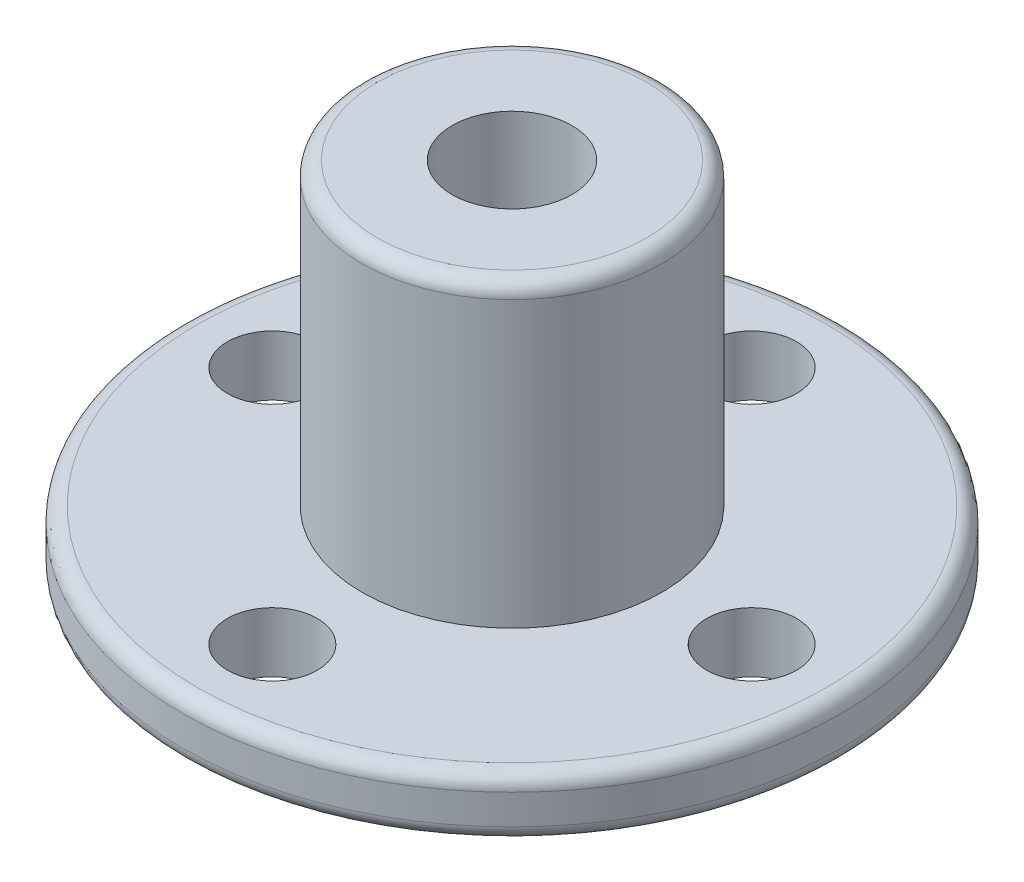
ISO-10303-21;
HEADER;
FILE_DESCRIPTION(('STEP AP214'),'2;1');
FILE_NAME('part.step','',(''),(''),'','','');
FILE_SCHEMA(('AUTOMOTIVE_DESIGN { 1 0 10303 214 1 1 1 1 }'));
ENDSEC;
DATA;
#1=APPLICATION_CONTEXT('core data for automotive mechanical design processes');
#2=APPLICATION_PROTOCOL_DEFINITION('international standard','automotive_design',2000,#1);
#3=PRODUCT_CONTEXT('',#1,'mechanical');
#4=PRODUCT('Part','Part','',(#3));
#5=PRODUCT_RELATED_PRODUCT_CATEGORY('part','',(#4));
#6=PRODUCT_DEFINITION_FORMATION('','',#4);
#7=PRODUCT_DEFINITION_CONTEXT('part definition',#1,'design');
#8=PRODUCT_DEFINITION('design','',#6,#7);
#9=PRODUCT_DEFINITION_SHAPE('','',#8);
#10=(LENGTH_UNIT() NAMED_UNIT(*) SI_UNIT(.MILLI.,.METRE.));
#11=(NAMED_UNIT(*) PLANE_ANGLE_UNIT() SI_UNIT($,.RADIAN.));
#12=(NAMED_UNIT(*) SI_UNIT($,.STERADIAN.) SOLID_ANGLE_UNIT());
#13=UNCERTAINTY_MEASURE_WITH_UNIT(LENGTH_MEASURE(1.E-05),#10,'distance_accuracy_value','');
#14=(GEOMETRIC_REPRESENTATION_CONTEXT(3) GLOBAL_UNCERTAINTY_ASSIGNED_CONTEXT((#13)) GLOBAL_UNIT_ASSIGNED_CONTEXT((#10,
#11,#12)) REPRESENTATION_CONTEXT('',''));
#15=CARTESIAN_POINT('',(0.,0.,0.));
#16=DIRECTION('',(0.,0.,1.));
#17=DIRECTION('',(1.,0.,0.));
#18=AXIS2_PLACEMENT_3D('',#15,#16,#17);
#19=CARTESIAN_POINT('',(0.,2.,0.));
#20=DIRECTION('',(0.,-1.,0.));
#21=DIRECTION('',(0.,0.,-1.));
#22=AXIS2_PLACEMENT_3D('',#19,#20,#21);
#23=CYLINDRICAL_SURFACE('',#22,11.);
#24=CARTESIAN_POINT('',(0.,0.5,0.));
#25=DIRECTION('',(0.,1.,0.));
#26=DIRECTION('',(0.,0.,1.));
#27=AXIS2_PLACEMENT_3D('',#24,#25,#26);
#28=CIRCLE('',#27,11.);
#29=CARTESIAN_POINT('',(0.,0.5,11.));
#30=VERTEX_POINT('',#29);
#31=EDGE_CURVE('E57',#30,#30,#28,.T.);
#32=ORIENTED_EDGE('',*,*,#31,.T.);
#33=EDGE_LOOP('',(#32));
#34=FACE_BOUND('',#33,.T.);
#35=CARTESIAN_POINT('',(0.,1.5,0.));
#36=DIRECTION('',(0.,1.,0.));
#37=DIRECTION('',(0.,0.,1.));
#38=AXIS2_PLACEMENT_3D('',#35,#36,#37);
#39=CIRCLE('',#38,11.);
#40=CARTESIAN_POINT('',(0.,1.5,11.));
#41=VERTEX_POINT('',#40);
#42=EDGE_CURVE('E60',#41,#41,#39,.F.);
#43=ORIENTED_EDGE('',*,*,#42,.T.);
#44=EDGE_LOOP('',(#43));
#45=FACE_BOUND('',#44,.T.);
#46=ADVANCED_FACE('F37',(#34,#45),#23,.T.);
#47=CARTESIAN_POINT('',(0.,2.,0.));
#48=DIRECTION('',(0.,1.,0.));
#49=DIRECTION('',(0.,0.,1.));
#50=AXIS2_PLACEMENT_3D('',#47,#48,#49);
#51=PLANE('',#50);
#52=CARTESIAN_POINT('',(0.,2.,0.));
#53=DIRECTION('',(0.,1.,0.));
#54=DIRECTION('',(0.,0.,1.));
#55=AXIS2_PLACEMENT_3D('',#52,#53,#54);
#56=CIRCLE('',#55,10.5);
#57=CARTESIAN_POINT('',(0.,2.,10.5));
#58=VERTEX_POINT('',#57);
#59=EDGE_CURVE('E48',#58,#58,#56,.T.);
#60=ORIENTED_EDGE('',*,*,#59,.T.);
#61=EDGE_LOOP('',(#60));
#62=FACE_BOUND('',#61,.T.);
#63=CARTESIAN_POINT('',(0.,2.,0.));
#64=DIRECTION('',(0.,1.,0.));
#65=DIRECTION('',(0.,0.,1.));
#66=AXIS2_PLACEMENT_3D('',#63,#64,#65);
#67=CIRCLE('',#66,5.);
#68=CARTESIAN_POINT('',(0.,2.,5.));
#69=VERTEX_POINT('',#68);
#70=EDGE_CURVE('E68',#69,#69,#67,.T.);
#71=ORIENTED_EDGE('',*,*,#70,.F.);
#72=EDGE_LOOP('',(#71));
#73=FACE_BOUND('',#72,.T.);
#74=CARTESIAN_POINT('',(0.,2.,-8.));
#75=DIRECTION('',(0.,1.,0.));
#76=DIRECTION('',(0.,0.,1.));
#77=AXIS2_PLACEMENT_3D('',#74,#75,#76);
#78=CIRCLE('',#77,1.5);
#79=CARTESIAN_POINT('',(0.,2.,-6.5));
#80=VERTEX_POINT('',#79);
#81=EDGE_CURVE('E83',#80,#80,#78,.T.);
#82=ORIENTED_EDGE('',*,*,#81,.F.);
#83=EDGE_LOOP('',(#82));
#84=FACE_BOUND('',#83,.T.);
#85=CARTESIAN_POINT('',(8.,2.,0.));
#86=DIRECTION('',(0.,1.,0.));
#87=DIRECTION('',(0.,0.,1.));
#88=AXIS2_PLACEMENT_3D('',#85,#86,#87);
#89=CIRCLE('',#88,1.5);
#90=CARTESIAN_POINT('',(8.,2.,1.5));
#91=VERTEX_POINT('',#90);
#92=EDGE_CURVE('E80',#91,#91,#89,.T.);
#93=ORIENTED_EDGE('',*,*,#92,.F.);
#94=EDGE_LOOP('',(#93));
#95=FACE_BOUND('',#94,.T.);
#96=CARTESIAN_POINT('',(0.,2.,8.));
#97=DIRECTION('',(0.,1.,0.));
#98=DIRECTION('',(0.,0.,1.));
#99=AXIS2_PLACEMENT_3D('',#96,#97,#98);
#100=CIRCLE('',#99,1.5);
#101=CARTESIAN_POINT('',(0.,2.,9.5));
#102=VERTEX_POINT('',#101);
#103=EDGE_CURVE('E74',#102,#102,#100,.T.);
#104=ORIENTED_EDGE('',*,*,#103,.F.);
#105=EDGE_LOOP('',(#104));
#106=FACE_BOUND('',#105,.T.);
#107=CARTESIAN_POINT('',(-8.,2.,0.));
#108=DIRECTION('',(0.,1.,0.));
#109=DIRECTION('',(0.,0.,1.));
#110=AXIS2_PLACEMENT_3D('',#107,#108,#109);
#111=CIRCLE('',#110,1.5);
#112=CARTESIAN_POINT('',(-8.,2.,1.5));
#113=VERTEX_POINT('',#112);
#114=EDGE_CURVE('E67',#113,#113,#111,.T.);
#115=ORIENTED_EDGE('',*,*,#114,.F.);
#116=EDGE_LOOP('',(#115));
#117=FACE_BOUND('',#116,.T.);
#118=ADVANCED_FACE('F146',(#62,#73,#84,#95,#106,#117),#51,.T.);
#119=CARTESIAN_POINT('',(0.,0.,0.));
#120=DIRECTION('',(0.,1.,0.));
#121=DIRECTION('',(0.,0.,1.));
#122=AXIS2_PLACEMENT_3D('',#119,#120,#121);
#123=PLANE('',#122);
#124=CARTESIAN_POINT('',(0.,0.,0.));
#125=DIRECTION('',(0.,1.,0.));
#126=DIRECTION('',(0.,0.,1.));
#127=AXIS2_PLACEMENT_3D('',#124,#125,#126);
#128=CIRCLE('',#127,10.5);
#129=CARTESIAN_POINT('',(0.,0.,10.5));
#130=VERTEX_POINT('',#129);
#131=EDGE_CURVE('E52',#130,#130,#128,.F.);
#132=ORIENTED_EDGE('',*,*,#131,.T.);
#133=EDGE_LOOP('',(#132));
#134=FACE_BOUND('',#133,.T.);
#135=CARTESIAN_POINT('',(0.,0.,0.));
#136=DIRECTION('',(0.,1.,0.));
#137=DIRECTION('',(0.,0.,1.));
#138=AXIS2_PLACEMENT_3D('',#135,#136,#137);
#139=CIRCLE('',#138,2.);
#140=CARTESIAN_POINT('',(0.,0.,2.));
#141=VERTEX_POINT('',#140);
#142=EDGE_CURVE('E90',#141,#141,#139,.T.);
#143=ORIENTED_EDGE('',*,*,#142,.T.);
#144=EDGE_LOOP('',(#143));
#145=FACE_BOUND('',#144,.T.);
#146=CARTESIAN_POINT('',(0.,0.,-8.));
#147=DIRECTION('',(0.,1.,0.));
#148=DIRECTION('',(0.,0.,1.));
#149=AXIS2_PLACEMENT_3D('',#146,#147,#148);
#150=CIRCLE('',#149,1.5);
#151=CARTESIAN_POINT('',(0.,0.,-6.5));
#152=VERTEX_POINT('',#151);
#153=EDGE_CURVE('E63',#152,#152,#150,.T.);
#154=ORIENTED_EDGE('',*,*,#153,.T.);
#155=EDGE_LOOP('',(#154));
#156=FACE_BOUND('',#155,.T.);
#157=CARTESIAN_POINT('',(8.,0.,0.));
#158=DIRECTION('',(0.,1.,0.));
#159=DIRECTION('',(0.,0.,1.));
#160=AXIS2_PLACEMENT_3D('',#157,#158,#159);
#161=CIRCLE('',#160,1.5);
#162=CARTESIAN_POINT('',(8.,0.,1.5));
#163=VERTEX_POINT('',#162);
#164=EDGE_CURVE('E77',#163,#163,#161,.T.);
#165=ORIENTED_EDGE('',*,*,#164,.T.);
#166=EDGE_LOOP('',(#165));
#167=FACE_BOUND('',#166,.T.);
#168=CARTESIAN_POINT('',(0.,0.,8.));
#169=DIRECTION('',(0.,1.,0.));
#170=DIRECTION('',(0.,0.,1.));
#171=AXIS2_PLACEMENT_3D('',#168,#169,#170);
#172=CIRCLE('',#171,1.5);
#173=CARTESIAN_POINT('',(0.,0.,9.5));
#174=VERTEX_POINT('',#173);
#175=EDGE_CURVE('E71',#174,#174,#172,.T.);
#176=ORIENTED_EDGE('',*,*,#175,.T.);
#177=EDGE_LOOP('',(#176));
#178=FACE_BOUND('',#177,.T.);
#179=CARTESIAN_POINT('',(-8.,0.,0.));
#180=DIRECTION('',(0.,1.,0.));
#181=DIRECTION('',(0.,0.,1.));
#182=AXIS2_PLACEMENT_3D('',#179,#180,#181);
#183=CIRCLE('',#182,1.5);
#184=CARTESIAN_POINT('',(-8.,0.,1.5));
#185=VERTEX_POINT('',#184);
#186=EDGE_CURVE('E64',#185,#185,#183,.T.);
#187=ORIENTED_EDGE('',*,*,#186,.T.);
#188=EDGE_LOOP('',(#187));
#189=FACE_BOUND('',#188,.T.);
#190=ADVANCED_FACE('F144',(#134,#145,#156,#167,#178,#189),#123,.F.);
#191=CARTESIAN_POINT('',(-8.,0.,0.));
#192=DIRECTION('',(0.,1.,0.));
#193=DIRECTION('',(0.,0.,1.));
#194=AXIS2_PLACEMENT_3D('',#191,#192,#193);
#195=CYLINDRICAL_SURFACE('',#194,1.5);
#196=ORIENTED_EDGE('',*,*,#186,.F.);
#197=EDGE_LOOP('',(#196));
#198=FACE_BOUND('',#197,.T.);
#199=ORIENTED_EDGE('',*,*,#114,.T.);
#200=EDGE_LOOP('',(#199));
#201=FACE_BOUND('',#200,.T.);
#202=ADVANCED_FACE('F140',(#198,#201),#195,.F.);
#203=CARTESIAN_POINT('',(0.,0.,8.));
#204=DIRECTION('',(0.,1.,0.));
#205=DIRECTION('',(0.,0.,1.));
#206=AXIS2_PLACEMENT_3D('',#203,#204,#205);
#207=CYLINDRICAL_SURFACE('',#206,1.5);
#208=ORIENTED_EDGE('',*,*,#175,.F.);
#209=EDGE_LOOP('',(#208));
#210=FACE_BOUND('',#209,.T.);
#211=ORIENTED_EDGE('',*,*,#103,.T.);
#212=EDGE_LOOP('',(#211));
#213=FACE_BOUND('',#212,.T.);
#214=ADVANCED_FACE('F136',(#210,#213),#207,.F.);
#215=CARTESIAN_POINT('',(8.,0.,0.));
#216=DIRECTION('',(0.,1.,0.));
#217=DIRECTION('',(0.,0.,1.));
#218=AXIS2_PLACEMENT_3D('',#215,#216,#217);
#219=CYLINDRICAL_SURFACE('',#218,1.5);
#220=ORIENTED_EDGE('',*,*,#164,.F.);
#221=EDGE_LOOP('',(#220));
#222=FACE_BOUND('',#221,.T.);
#223=ORIENTED_EDGE('',*,*,#92,.T.);
#224=EDGE_LOOP('',(#223));
#225=FACE_BOUND('',#224,.T.);
#226=ADVANCED_FACE('F132',(#222,#225),#219,.F.);
#227=CARTESIAN_POINT('',(0.,0.,-8.));
#228=DIRECTION('',(0.,1.,0.));
#229=DIRECTION('',(0.,0.,1.));
#230=AXIS2_PLACEMENT_3D('',#227,#228,#229);
#231=CYLINDRICAL_SURFACE('',#230,1.5);
#232=ORIENTED_EDGE('',*,*,#153,.F.);
#233=EDGE_LOOP('',(#232));
#234=FACE_BOUND('',#233,.T.);
#235=ORIENTED_EDGE('',*,*,#81,.T.);
#236=EDGE_LOOP('',(#235));
#237=FACE_BOUND('',#236,.T.);
#238=ADVANCED_FACE('F128',(#234,#237),#231,.F.);
#239=CARTESIAN_POINT('',(0.,12.,0.));
#240=DIRECTION('',(0.,-1.,0.));
#241=DIRECTION('',(0.,0.,-1.));
#242=AXIS2_PLACEMENT_3D('',#239,#240,#241);
#243=CYLINDRICAL_SURFACE('',#242,5.);
#244=CARTESIAN_POINT('',(1.5,7.,-4.76969600708473));
#245=CARTESIAN_POINT('',(1.49999897633764,6.9178054520576,-4.7696968572698));
#246=CARTESIAN_POINT('',(1.49322108167142,6.83560077585598,-4.77184390209069));
#247=CARTESIAN_POINT('',(1.46635844446749,6.67359475040806,-4.780165783029));
#248=CARTESIAN_POINT('',(1.44626925573578,6.59379421349853,-4.78634196493468));
#249=CARTESIAN_POINT('',(1.39352753269955,6.43896527172827,-4.80196102485633));
#250=CARTESIAN_POINT('',(1.36089589394243,6.36392917036691,-4.81139846703232));
#251=CARTESIAN_POINT('',(1.28406421917929,6.2203780660047,-4.83246932547567));
#252=CARTESIAN_POINT('',(1.23986245137053,6.15186404131556,-4.8441030704102));
#253=CARTESIAN_POINT('',(1.13964754141627,6.02113360942262,-4.86866862185766));
#254=CARTESIAN_POINT('',(1.08333207175807,5.95915410205371,-4.88162808311636));
#255=CARTESIAN_POINT('',(0.961136237579598,5.84536204867749,-4.90714861936757));
#256=CARTESIAN_POINT('',(0.895254645461111,5.79355080955012,-4.91970964297705));
#257=CARTESIAN_POINT('',(0.754111437793689,5.70053730016669,-4.94333214579389));
#258=CARTESIAN_POINT('',(0.678684021335814,5.65957657555719,-4.95435724342404));
#259=CARTESIAN_POINT('',(0.521624645369353,5.59101274095724,-4.97334435920684));
#260=CARTESIAN_POINT('',(0.43999402838791,5.56340675014255,-4.98130703789496));
#261=CARTESIAN_POINT('',(0.275323852630828,5.52311999890949,-4.9930764600359));
#262=CARTESIAN_POINT('',(0.192391398953799,5.5100348723473,-4.99699557369339));
#263=CARTESIAN_POINT('',(0.0254218237493133,5.49788267535356,-5.00063201501348));
#264=CARTESIAN_POINT('',(-0.0586150620503699,5.49881266059804,-5.00035022521079));
#265=CARTESIAN_POINT('',(-0.222571156600162,5.51439286854302,-4.99569603817659));
#266=CARTESIAN_POINT('',(-0.302536267641343,5.52860519380987,-4.9914542020526));
#267=CARTESIAN_POINT('',(-0.458889213442528,5.56963133599429,-4.97951522112593));
#268=CARTESIAN_POINT('',(-0.535276821322847,5.59644595094267,-4.97181785750586));
#269=CARTESIAN_POINT('',(-0.683347326351282,5.66221202341856,-4.95365220986963));
#270=CARTESIAN_POINT('',(-0.75496506469448,5.70130120280727,-4.94315269676706));
#271=CARTESIAN_POINT('',(-0.890764673783157,5.79039785242823,-4.92049640648069));
#272=CARTESIAN_POINT('',(-0.954944774872132,5.84040791296349,-4.90833923637778));
#273=CARTESIAN_POINT('',(-1.0766604815298,5.9521977507516,-4.88311550488166));
#274=CARTESIAN_POINT('',(-1.13384458040112,6.01435691902974,-4.87003195321461));
#275=CARTESIAN_POINT('',(-1.23707651539824,6.14751001789005,-4.84483979887497));
#276=CARTESIAN_POINT('',(-1.28312324482853,6.21850482538923,-4.8327312931702));
#277=CARTESIAN_POINT('',(-1.3631399533545,6.36823946924899,-4.81077903197678));
#278=CARTESIAN_POINT('',(-1.39698989237679,6.44704704586292,-4.80095810695957));
#279=CARTESIAN_POINT('',(-1.45083362878413,6.60960720844555,-4.78496392548436));
#280=CARTESIAN_POINT('',(-1.4708319464056,6.69335817153456,-4.7787894791583));
#281=CARTESIAN_POINT('',(-1.49574770282165,6.86008236073928,-4.77104849541242));
#282=CARTESIAN_POINT('',(-1.50119946380212,6.94296822389398,-4.76931878670441));
#283=CARTESIAN_POINT('',(-1.49835947233062,7.10847290000987,-4.77021192441924));
#284=CARTESIAN_POINT('',(-1.4900696437133,7.19109174873085,-4.77283416156589));
#285=CARTESIAN_POINT('',(-1.4604576357419,7.35148837797087,-4.78197558554912));
#286=CARTESIAN_POINT('',(-1.4394796143128,7.42933616426352,-4.78839176507489));
#287=CARTESIAN_POINT('',(-1.3854857774794,7.58040169081492,-4.80429141231227));
#288=CARTESIAN_POINT('',(-1.3524681034276,7.65361871414057,-4.81377535359073));
#289=CARTESIAN_POINT('',(-1.274318711965,7.79551746407213,-4.83505835023047));
#290=CARTESIAN_POINT('',(-1.22888564172729,7.86402472098579,-4.84691271069799));
#291=CARTESIAN_POINT('',(-1.12755301600385,7.9926381061808,-4.87148205646987));
#292=CARTESIAN_POINT('',(-1.07165095534897,8.05274221761279,-4.88419724730003));
#293=CARTESIAN_POINT('',(-0.948455132493598,8.16518040581474,-4.90963633548158));
#294=CARTESIAN_POINT('',(-0.880811065857434,8.21713562898698,-4.92234245063004));
#295=CARTESIAN_POINT('',(-0.737461784590248,8.30896670102775,-4.94584851748651));
#296=CARTESIAN_POINT('',(-0.661756970543943,8.34884314978146,-4.95664856384717));
#297=CARTESIAN_POINT('',(-0.50493550470522,8.4150000305683,-4.97505970474957));
#298=CARTESIAN_POINT('',(-0.423864622037837,8.44138201615898,-4.98269453424966));
#299=CARTESIAN_POINT('',(-0.258169966504586,8.48006091889042,-4.99401979596827));
#300=CARTESIAN_POINT('',(-0.173547217354761,8.49236186594842,-4.9977113567088));
#301=CARTESIAN_POINT('',(-0.00665215388274161,8.5022230440545,-5.00066544081399));
#302=CARTESIAN_POINT('',(0.0755851790862079,8.50033269540783,-5.00009305111322));
#303=CARTESIAN_POINT('',(0.238519481164405,8.48317836750088,-4.99497264465037));
#304=CARTESIAN_POINT('',(0.31921653734653,8.46791514651956,-4.99042485330463));
#305=CARTESIAN_POINT('',(0.475935813041359,8.42478833860038,-4.97791168358327));
#306=CARTESIAN_POINT('',(0.551998927351393,8.39706181935099,-4.96998352900866));
#307=CARTESIAN_POINT('',(0.698433237752054,8.32991808549281,-4.9515294303945));
#308=CARTESIAN_POINT('',(0.768803496050581,8.29049894971381,-4.94100305949946));
#309=CARTESIAN_POINT('',(0.904301892420564,8.19962654256996,-4.91803965828228));
#310=CARTESIAN_POINT('',(0.969190250076767,8.14782856999923,-4.90555226923559));
#311=CARTESIAN_POINT('',(1.08953757134594,8.0342896116672,-4.88023537212334));
#312=CARTESIAN_POINT('',(1.14499380960194,7.97254576210185,-4.86740576641079));
#313=CARTESIAN_POINT('',(1.24656269394549,7.83865922168949,-4.84240680631319));
#314=CARTESIAN_POINT('',(1.29234759757956,7.76626144660956,-4.83026852693485));
#315=CARTESIAN_POINT('',(1.37104313528776,7.61444482583898,-4.80852547508793));
#316=CARTESIAN_POINT('',(1.40395995557289,7.5350293763988,-4.79891948596956));
#317=CARTESIAN_POINT('',(1.4530194253295,7.38025956839372,-4.78427816717595));
#318=CARTESIAN_POINT('',(1.47058859011232,7.30539135306901,-4.7788615484052));
#319=CARTESIAN_POINT('',(1.49407818835144,7.15368477750423,-4.77157042597167));
#320=CARTESIAN_POINT('',(1.50000095706095,7.07684681535475,-4.76969521221431));
#321=CARTESIAN_POINT('',(1.5,7.,-4.76969600708473));
#322=B_SPLINE_CURVE_WITH_KNOTS('',3,(#244,#245,#246,#247,#248,#249,#250,#251,#252,#253,#254,
#255,#256,#257,#258,#259,#260,#261,#262,#263,#264,#265,#266,#267,#268,#269,#270,#271,#272,#273,
#274,#275,#276,#277,#278,#279,#280,#281,#282,#283,#284,#285,#286,#287,#288,#289,#290,#291,#292,
#293,#294,#295,#296,#297,#298,#299,#300,#301,#302,#303,#304,#305,#306,#307,#308,#309,#310,#311,
#312,#313,#314,#315,#316,#317,#318,#319,#320,#321),.UNSPECIFIED.,.T.,.F.,(4,2,2,2,2,2,2,2,2,2,2,
2,2,2,2,2,2,2,2,2,2,2,2,2,2,2,2,2,2,2,2,2,2,2,2,2,2,2,4),(0.,0.246300165915542,
0.492682641689001,0.738656414466194,0.984667025370102,1.23773150007984,1.49082847871273,
1.74915939273645,2.00743455587877,2.25832140149558,2.5091555410144,2.7520012599088,
2.99486235890376,3.24055209335676,3.48630016590831,3.74152147023278,3.99676812491863,
4.25446238246266,4.51207250628411,4.76008080790309,5.00805439107388,5.24958594938817,
5.49115481045787,5.73920731809389,5.98731925928923,6.24479506100602,6.50225807324202,
6.75775391814325,7.01317662321682,7.2587630391122,7.50433553047755,7.74727096872219,
7.99024634491378,8.24099627054488,8.4918185262989,8.75011639669147,9.00828993963944,
9.23861153857448,9.4688869503356),.UNSPECIFIED.);
#323=CARTESIAN_POINT('',(1.5,7.,-4.76969600708473));
#324=VERTEX_POINT('',#323);
#325=EDGE_CURVE('E94',#324,#324,#322,.T.);
#326=ORIENTED_EDGE('',*,*,#325,.F.);
#327=EDGE_LOOP('',(#326));
#328=FACE_BOUND('',#327,.T.);
#329=CARTESIAN_POINT('',(0.,11.5,0.));
#330=DIRECTION('',(0.,1.,0.));
#331=DIRECTION('',(0.,0.,1.));
#332=AXIS2_PLACEMENT_3D('',#329,#330,#331);
#333=CIRCLE('',#332,5.);
#334=CARTESIAN_POINT('',(0.,11.5,5.));
#335=VERTEX_POINT('',#334);
#336=EDGE_CURVE('E10',#335,#335,#333,.F.);
#337=ORIENTED_EDGE('',*,*,#336,.T.);
#338=EDGE_LOOP('',(#337));
#339=FACE_BOUND('',#338,.T.);
#340=ORIENTED_EDGE('',*,*,#70,.T.);
#341=EDGE_LOOP('',(#340));
#342=FACE_BOUND('',#341,.T.);
#343=ADVANCED_FACE('F125',(#328,#339,#342),#243,.T.);
#344=CARTESIAN_POINT('',(0.,12.,0.));
#345=DIRECTION('',(0.,1.,0.));
#346=DIRECTION('',(0.,0.,1.));
#347=AXIS2_PLACEMENT_3D('',#344,#345,#346);
#348=PLANE('',#347);
#349=CARTESIAN_POINT('',(0.,12.,0.));
#350=DIRECTION('',(0.,1.,0.));
#351=DIRECTION('',(0.,0.,1.));
#352=AXIS2_PLACEMENT_3D('',#349,#350,#351);
#353=CIRCLE('',#352,4.5);
#354=CARTESIAN_POINT('',(0.,12.,4.5));
#355=VERTEX_POINT('',#354);
#356=EDGE_CURVE('E44',#355,#355,#353,.T.);
#357=ORIENTED_EDGE('',*,*,#356,.T.);
#358=EDGE_LOOP('',(#357));
#359=FACE_BOUND('',#358,.T.);
#360=CARTESIAN_POINT('',(0.,12.,0.));
#361=DIRECTION('',(0.,1.,0.));
#362=DIRECTION('',(0.,0.,1.));
#363=AXIS2_PLACEMENT_3D('',#360,#361,#362);
#364=CIRCLE('',#363,2.);
#365=CARTESIAN_POINT('',(0.,12.,2.));
#366=VERTEX_POINT('',#365);
#367=EDGE_CURVE('E91',#366,#366,#364,.T.);
#368=ORIENTED_EDGE('',*,*,#367,.F.);
#369=EDGE_LOOP('',(#368));
#370=FACE_BOUND('',#369,.T.);
#371=ADVANCED_FACE('F121',(#359,#370),#348,.T.);
#372=CARTESIAN_POINT('',(0.,0.,0.));
#373=DIRECTION('',(0.,1.,0.));
#374=DIRECTION('',(0.,0.,1.));
#375=AXIS2_PLACEMENT_3D('',#372,#373,#374);
#376=CYLINDRICAL_SURFACE('',#375,2.);
#377=CARTESIAN_POINT('',(1.5,7.,-1.32287565553229));
#378=CARTESIAN_POINT('',(1.49999219049447,7.06999742342563,-1.32289190044095));
#379=CARTESIAN_POINT('',(1.4950410907442,7.14004583431192,-1.32856366615417));
#380=CARTESIAN_POINT('',(1.47578333210409,7.27732985620948,-1.34990644032801));
#381=CARTESIAN_POINT('',(1.46144878565587,7.34455644501951,-1.3656072516867));
#382=CARTESIAN_POINT('',(1.42483838991846,7.47357984673838,-1.4037512791687));
#383=CARTESIAN_POINT('',(1.40267483444956,7.53543877676246,-1.42609848244814));
#384=CARTESIAN_POINT('',(1.35130655299363,7.65434545444519,-1.47486455031267));
#385=CARTESIAN_POINT('',(1.3221026780169,7.71139378246922,-1.50128292264932));
#386=CARTESIAN_POINT('',(1.25039909811054,7.83211279631659,-1.56177312961147));
#387=CARTESIAN_POINT('',(1.20639573950363,7.89466793422647,-1.59628904009787));
#388=CARTESIAN_POINT('',(1.10933596759308,8.01252546624227,-1.66521164096378));
#389=CARTESIAN_POINT('',(1.05626622282799,8.06781696482027,-1.69961809339876));
#390=CARTESIAN_POINT('',(0.929610192252515,8.18085873865547,-1.77262582436251));
#391=CARTESIAN_POINT('',(0.854047289142164,8.23680596671985,-1.81064921229759));
#392=CARTESIAN_POINT('',(0.69118971482194,8.33462220828284,-1.87882809751632));
#393=CARTESIAN_POINT('',(0.603923293836166,8.37652429746881,-1.90900204180106));
#394=CARTESIAN_POINT('',(0.447869023983644,8.43320768590294,-1.95034258990248));
#395=CARTESIAN_POINT('',(0.381446049692535,8.45235709597847,-1.96449710921006));
#396=CARTESIAN_POINT('',(0.245552609316541,8.48139011599675,-1.98605635937555));
#397=CARTESIAN_POINT('',(0.176084845995169,8.49128177610674,-1.99346695432364));
#398=CARTESIAN_POINT('',(0.0358650926220274,8.50122173386249,-2.00091375578087));
#399=CARTESIAN_POINT('',(-0.0348897591186392,8.50124445437644,-2.00093080057496));
#400=CARTESIAN_POINT('',(-0.175316156674037,8.49138206321971,-1.99354206503066));
#401=CARTESIAN_POINT('',(-0.244987447822227,8.48149465709186,-1.98613456571337));
#402=CARTESIAN_POINT('',(-0.378889193792651,8.45291894941013,-1.96491377944411));
#403=CARTESIAN_POINT('',(-0.443224268236295,8.43454367361293,-1.9513285776568));
#404=CARTESIAN_POINT('',(-0.567680485046396,8.39000435781776,-1.91882278657017));
#405=CARTESIAN_POINT('',(-0.627800705033635,8.36383861948684,-1.89990103394193));
#406=CARTESIAN_POINT('',(-0.74921692186473,8.30147038485469,-1.85561045984504));
#407=CARTESIAN_POINT('',(-0.809935384713599,8.26448790338124,-1.82976540608097));
#408=CARTESIAN_POINT('',(-0.924567250548285,8.18326629602949,-1.77460702483739));
#409=CARTESIAN_POINT('',(-0.978474784621221,8.1390209863001,-1.74529074780453));
#410=CARTESIAN_POINT('',(-1.08908204283329,8.03477665117906,-1.6789376587236));
#411=CARTESIAN_POINT('',(-1.14424493004784,7.9733907899736,-1.64151655866368));
#412=CARTESIAN_POINT('',(-1.24400875556228,7.84216541637806,-1.5672595828377));
#413=CARTESIAN_POINT('',(-1.28860466211477,7.77232190047494,-1.53042399363524));
#414=CARTESIAN_POINT('',(-1.358732064116,7.63901812975437,-1.46819425999159));
#415=CARTESIAN_POINT('',(-1.38628866868102,7.57701295469935,-1.44197599789983));
#416=CARTESIAN_POINT('',(-1.43319397108784,7.44793471858062,-1.39536741257394));
#417=CARTESIAN_POINT('',(-1.45256121808259,7.38087352030963,-1.37496395320511));
#418=CARTESIAN_POINT('',(-1.47902385350669,7.25631305600168,-1.34640050620232));
#419=CARTESIAN_POINT('',(-1.48779069496582,7.19955291788314,-1.3366153955687));
#420=CARTESIAN_POINT('',(-1.49871760619789,7.08464453382618,-1.32435588438334));
#421=CARTESIAN_POINT('',(-1.50088612873265,7.02649816009718,-1.32187213058307));
#422=CARTESIAN_POINT('',(-1.49845270115552,6.9105210082666,-1.32462868790497));
#423=CARTESIAN_POINT('',(-1.4938482589949,6.85269035419033,-1.32987184207164));
#424=CARTESIAN_POINT('',(-1.47822527271969,6.73892384755713,-1.34721218775046));
#425=CARTESIAN_POINT('',(-1.46719578056394,6.6829914020519,-1.35932107727345));
#426=CARTESIAN_POINT('',(-1.43413959562387,6.55366195506113,-1.39427758287802));
#427=CARTESIAN_POINT('',(-1.40954189769242,6.48156404608497,-1.41944823697315));
#428=CARTESIAN_POINT('',(-1.35088877838435,6.34369233635988,-1.47537861079975));
#429=CARTESIAN_POINT('',(-1.31681594335477,6.27793048270525,-1.5061485847723));
#430=CARTESIAN_POINT('',(-1.23869774116696,6.15065099195188,-1.5710828237565));
#431=CARTESIAN_POINT('',(-1.19434110060341,6.08936712378174,-1.60532883846046));
#432=CARTESIAN_POINT('',(-1.09682562914592,5.97399790363875,-1.67347506272361));
#433=CARTESIAN_POINT('',(-1.04366252194463,5.91991607201106,-1.70737509574665));
#434=CARTESIAN_POINT('',(-0.91623451382962,5.80872300837063,-1.77960222623532));
#435=CARTESIAN_POINT('',(-0.839896270946855,5.7535247611424,-1.81728174165357));
#436=CARTESIAN_POINT('',(-0.675551612651266,5.65737926654913,-1.88453104769825));
#437=CARTESIAN_POINT('',(-0.58757102997485,5.61640117541871,-1.91411836052283));
#438=CARTESIAN_POINT('',(-0.430755661496909,5.56156200855313,-1.9541940640238));
#439=CARTESIAN_POINT('',(-0.364250057327471,5.54324320672456,-1.9677547802964));
#440=CARTESIAN_POINT('',(-0.22836446496435,5.51587120369248,-1.98810265589123));
#441=CARTESIAN_POINT('',(-0.158987104561941,5.50680971845149,-1.9948958710696));
#442=CARTESIAN_POINT('',(-0.0191476059403976,5.4984836090714,-2.00113566717062));
#443=CARTESIAN_POINT('',(0.0513166925870884,5.49924198265176,-2.00056500218907));
#444=CARTESIAN_POINT('',(0.191009011030082,5.51056099130124,-1.9920880324381));
#445=CARTESIAN_POINT('',(0.26023669659129,5.52112423770748,-1.98417977344351));
#446=CARTESIAN_POINT('',(0.393521935254973,5.55097491616724,-1.96203400925195));
#447=CARTESIAN_POINT('',(0.457671236511443,5.57000018132155,-1.94798690792879));
#448=CARTESIAN_POINT('',(0.58166134309739,5.61578806561894,-1.91462720575136));
#449=CARTESIAN_POINT('',(0.641501223388816,5.64255233983091,-1.89531347862386));
#450=CARTESIAN_POINT('',(0.762547698766813,5.70627793759597,-1.8501764221064));
#451=CARTESIAN_POINT('',(0.823141236713419,5.74405093135959,-1.82386352707581));
#452=CARTESIAN_POINT('',(0.937414811724215,5.82686644055421,-1.76785506075717));
#453=CARTESIAN_POINT('',(0.991088412383374,5.87191563728605,-1.73815638795658));
#454=CARTESIAN_POINT('',(1.10112380660681,5.97800536656079,-1.67106353042106));
#455=CARTESIAN_POINT('',(1.15591691541996,6.04044639943991,-1.63330922504697));
#456=CARTESIAN_POINT('',(1.2547525342935,6.17386807189988,-1.55866082463332));
#457=CARTESIAN_POINT('',(1.29879110556729,6.24485182603657,-1.52176704921892));
#458=CARTESIAN_POINT('',(1.36695971301455,6.37888325059031,-1.46049601449284));
#459=CARTESIAN_POINT('',(1.39333526337998,6.44033498270656,-1.43513625007637));
#460=CARTESIAN_POINT('',(1.43805398028599,6.56808291305588,-1.39032564651232));
#461=CARTESIAN_POINT('',(1.45641847678344,6.63436569159545,-1.37085915899696));
#462=CARTESIAN_POINT('',(1.4799705775638,6.75078821959693,-1.34532423383262));
#463=CARTESIAN_POINT('',(1.48744249026867,6.79996707129047,-1.3370013026568));
#464=CARTESIAN_POINT('',(1.49745839072448,6.89942233303366,-1.32577295392455));
#465=CARTESIAN_POINT('',(1.50000561211714,6.94969800094373,-1.32286398151145));
#466=CARTESIAN_POINT('',(1.5,7.,-1.32287565553229));
#467=B_SPLINE_CURVE_WITH_KNOTS('',3,(#377,#378,#379,#380,#381,#382,#383,#384,#385,#386,#387,
#388,#389,#390,#391,#392,#393,#394,#395,#396,#397,#398,#399,#400,#401,#402,#403,#404,#405,#406,
#407,#408,#409,#410,#411,#412,#413,#414,#415,#416,#417,#418,#419,#420,#421,#422,#423,#424,#425,
#426,#427,#428,#429,#430,#431,#432,#433,#434,#435,#436,#437,#438,#439,#440,#441,#442,#443,#444,
#445,#446,#447,#448,#449,#450,#451,#452,#453,#454,#455,#456,#457,#458,#459,#460,#461,#462,#463,
#464,#465,#466),.UNSPECIFIED.,.T.,.F.,(4,2,2,2,2,2,2,2,2,2,2,2,2,2,2,2,2,2,2,2,2,2,2,2,2,2,2,2,
2,2,2,2,2,2,2,2,2,2,2,2,2,2,2,2,4),(0.,0.209731776684489,0.420089722582994,0.627545385620137,
0.834975984672344,1.08585208691169,1.33710031031849,1.63964848103538,1.94147907444963,
2.15227725277555,2.36289195870711,2.57405250727807,2.78526195641288,2.9892375589505,
3.19325766108669,3.41936844116895,3.64567274887663,3.91649517204702,4.18744629647933,
4.40499409477196,4.62204646613006,4.79608005545901,4.96989060538193,5.14376512326213,
5.31793678696019,5.55730028202397,5.79710662639151,6.0454320909006,6.29387849446618,
6.59652499511463,6.89851088586565,7.10852896194427,7.31835893539181,7.52868041101043,
7.73905791773945,7.94332812691912,8.14764205379333,8.3751005248961,8.60276905744644,
8.87547580578155,9.14828228208531,9.36218279640835,9.57551025772699,9.72632812073766,
9.87704692032409),.UNSPECIFIED.);
#468=CARTESIAN_POINT('',(1.5,7.,-1.32287565553229));
#469=VERTEX_POINT('',#468);
#470=EDGE_CURVE('E104',#469,#469,#467,.T.);
#471=ORIENTED_EDGE('',*,*,#470,.F.);
#472=EDGE_LOOP('',(#471));
#473=FACE_BOUND('',#472,.T.);
#474=ORIENTED_EDGE('',*,*,#142,.F.);
#475=EDGE_LOOP('',(#474));
#476=FACE_BOUND('',#475,.T.);
#477=ORIENTED_EDGE('',*,*,#367,.T.);
#478=EDGE_LOOP('',(#477));
#479=FACE_BOUND('',#478,.T.);
#480=ADVANCED_FACE('F116',(#473,#476,#479),#376,.F.);
#481=CARTESIAN_POINT('',(0.,0.5,0.));
#482=DIRECTION('',(0.,1.,0.));
#483=DIRECTION('',(0.,0.,1.));
#484=AXIS2_PLACEMENT_3D('',#481,#482,#483);
#485=TOROIDAL_SURFACE('',#484,10.5,0.5);
#486=ORIENTED_EDGE('',*,*,#131,.F.);
#487=EDGE_LOOP('',(#486));
#488=FACE_BOUND('',#487,.T.);
#489=ORIENTED_EDGE('',*,*,#31,.F.);
#490=EDGE_LOOP('',(#489));
#491=FACE_BOUND('',#490,.T.);
#492=ADVANCED_FACE('F120',(#488,#491),#485,.T.);
#493=CARTESIAN_POINT('',(0.,1.5,0.));
#494=DIRECTION('',(0.,1.,0.));
#495=DIRECTION('',(0.,0.,1.));
#496=AXIS2_PLACEMENT_3D('',#493,#494,#495);
#497=TOROIDAL_SURFACE('',#496,10.5,0.5);
#498=ORIENTED_EDGE('',*,*,#42,.F.);
#499=EDGE_LOOP('',(#498));
#500=FACE_BOUND('',#499,.T.);
#501=ORIENTED_EDGE('',*,*,#59,.F.);
#502=EDGE_LOOP('',(#501));
#503=FACE_BOUND('',#502,.T.);
#504=ADVANCED_FACE('F157',(#500,#503),#497,.T.);
#505=CARTESIAN_POINT('',(0.,11.5,0.));
#506=DIRECTION('',(0.,1.,0.));
#507=DIRECTION('',(0.,0.,1.));
#508=AXIS2_PLACEMENT_3D('',#505,#506,#507);
#509=TOROIDAL_SURFACE('',#508,4.5,0.5);
#510=ORIENTED_EDGE('',*,*,#336,.F.);
#511=EDGE_LOOP('',(#510));
#512=FACE_BOUND('',#511,.T.);
#513=ORIENTED_EDGE('',*,*,#356,.F.);
#514=EDGE_LOOP('',(#513));
#515=FACE_BOUND('',#514,.T.);
#516=ADVANCED_FACE('F39',(#512,#515),#509,.T.);
#517=CARTESIAN_POINT('',(0.,7.,-11.001));
#518=DIRECTION('',(0.,0.,1.));
#519=DIRECTION('',(1.,0.,0.));
#520=AXIS2_PLACEMENT_3D('',#517,#518,#519);
#521=CYLINDRICAL_SURFACE('',#520,1.5);
#522=ORIENTED_EDGE('',*,*,#470,.T.);
#523=EDGE_LOOP('',(#522));
#524=FACE_BOUND('',#523,.T.);
#525=ORIENTED_EDGE('',*,*,#325,.T.);
#526=EDGE_LOOP('',(#525));
#527=FACE_BOUND('',#526,.T.);
#528=ADVANCED_FACE('F109',(#524,#527),#521,.F.);
#529=CLOSED_SHELL('',(#46,#118,#190,#202,#214,#226,#238,#343,#371,#480,#492,#504,#516,#528));
#530=MANIFOLD_SOLID_BREP('B2',#529);
#531=ADVANCED_BREP_SHAPE_REPRESENTATION('',(#18,#530),#14);
#532=SHAPE_DEFINITION_REPRESENTATION(#9,#531);
ENDSEC;
END-ISO-10303-21;
